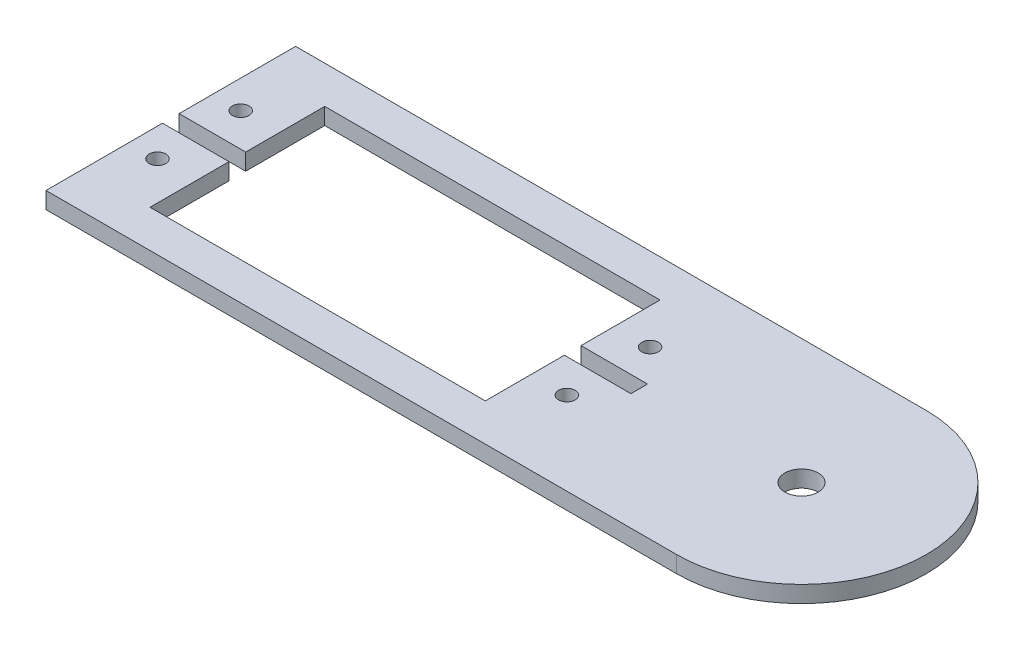
ISO-10303-21;
HEADER;
FILE_DESCRIPTION(('STEP AP214'),'2;1');
FILE_NAME('part.step','',(''),(''),'','','');
FILE_SCHEMA(('AUTOMOTIVE_DESIGN { 1 0 10303 214 1 1 1 1 }'));
ENDSEC;
DATA;
#1=APPLICATION_CONTEXT('core data for automotive mechanical design processes');
#2=APPLICATION_PROTOCOL_DEFINITION('international standard','automotive_design',2000,#1);
#3=PRODUCT_CONTEXT('',#1,'mechanical');
#4=PRODUCT('Part','Part','',(#3));
#5=PRODUCT_RELATED_PRODUCT_CATEGORY('part','',(#4));
#6=PRODUCT_DEFINITION_FORMATION('','',#4);
#7=PRODUCT_DEFINITION_CONTEXT('part definition',#1,'design');
#8=PRODUCT_DEFINITION('design','',#6,#7);
#9=PRODUCT_DEFINITION_SHAPE('','',#8);
#10=(LENGTH_UNIT() NAMED_UNIT(*) SI_UNIT(.MILLI.,.METRE.));
#11=(NAMED_UNIT(*) PLANE_ANGLE_UNIT() SI_UNIT($,.RADIAN.));
#12=(NAMED_UNIT(*) SI_UNIT($,.STERADIAN.) SOLID_ANGLE_UNIT());
#13=UNCERTAINTY_MEASURE_WITH_UNIT(LENGTH_MEASURE(1.E-05),#10,'distance_accuracy_value','');
#14=(GEOMETRIC_REPRESENTATION_CONTEXT(3) GLOBAL_UNCERTAINTY_ASSIGNED_CONTEXT((#13)) GLOBAL_UNIT_ASSIGNED_CONTEXT((#10,
#11,#12)) REPRESENTATION_CONTEXT('',''));
#15=CARTESIAN_POINT('',(0.,0.,0.));
#16=DIRECTION('',(0.,0.,1.));
#17=DIRECTION('',(1.,0.,0.));
#18=AXIS2_PLACEMENT_3D('',#15,#16,#17);
#19=CARTESIAN_POINT('',(75.8,2.,-15.));
#20=DIRECTION('',(0.,1.,0.));
#21=DIRECTION('',(0.,0.,1.));
#22=AXIS2_PLACEMENT_3D('',#19,#20,#21);
#23=PLANE('',#22);
#24=CARTESIAN_POINT('',(52.6,2.,-20.));
#25=DIRECTION('',(0.,1.,0.));
#26=DIRECTION('',(0.,0.,1.));
#27=AXIS2_PLACEMENT_3D('',#24,#25,#26);
#28=CIRCLE('',#27,0.999999999999998);
#29=CARTESIAN_POINT('',(52.6,2.,-19.));
#30=VERTEX_POINT('',#29);
#31=EDGE_CURVE('E349',#30,#30,#28,.T.);
#32=ORIENTED_EDGE('',*,*,#31,.F.);
#33=EDGE_LOOP('',(#32));
#34=FACE_BOUND('',#33,.T.);
#35=CARTESIAN_POINT('',(3.4,2.,-20.));
#36=DIRECTION('',(0.,1.,0.));
#37=DIRECTION('',(0.,0.,1.));
#38=AXIS2_PLACEMENT_3D('',#35,#36,#37);
#39=CIRCLE('',#38,0.999999999999999);
#40=CARTESIAN_POINT('',(3.4,2.,-19.));
#41=VERTEX_POINT('',#40);
#42=EDGE_CURVE('E361',#41,#41,#39,.T.);
#43=ORIENTED_EDGE('',*,*,#42,.F.);
#44=EDGE_LOOP('',(#43));
#45=FACE_BOUND('',#44,.T.);
#46=DIRECTION('',(1.,0.,0.));
#47=VECTOR('',#46,1.);
#48=CARTESIAN_POINT('',(0.,2.,0.));
#49=LINE('',#48,#47);
#50=CARTESIAN_POINT('',(0.,2.,0.));
#51=VERTEX_POINT('',#50);
#52=CARTESIAN_POINT('',(75.8,2.,0.));
#53=VERTEX_POINT('',#52);
#54=EDGE_CURVE('E211',#51,#53,#49,.T.);
#55=ORIENTED_EDGE('',*,*,#54,.T.);
#56=CARTESIAN_POINT('',(75.8,2.,-15.));
#57=DIRECTION('',(0.,1.,0.));
#58=DIRECTION('',(0.,0.,1.));
#59=AXIS2_PLACEMENT_3D('',#56,#57,#58);
#60=CIRCLE('',#59,15.);
#61=CARTESIAN_POINT('',(75.8,2.,-30.));
#62=VERTEX_POINT('',#61);
#63=EDGE_CURVE('E119',#53,#62,#60,.T.);
#64=ORIENTED_EDGE('',*,*,#63,.T.);
#65=DIRECTION('',(-1.,0.,0.));
#66=VECTOR('',#65,1.);
#67=CARTESIAN_POINT('',(0.,2.,-30.));
#68=LINE('',#67,#66);
#69=CARTESIAN_POINT('',(0.,2.,-30.));
#70=VERTEX_POINT('',#69);
#71=EDGE_CURVE('E250',#62,#70,#68,.T.);
#72=ORIENTED_EDGE('',*,*,#71,.T.);
#73=DIRECTION('',(0.,0.,1.));
#74=VECTOR('',#73,1.);
#75=CARTESIAN_POINT('',(0.,2.,-30.));
#76=LINE('',#75,#74);
#77=CARTESIAN_POINT('',(0.,2.,-16.));
#78=VERTEX_POINT('',#77);
#79=EDGE_CURVE('E269',#70,#78,#76,.T.);
#80=ORIENTED_EDGE('',*,*,#79,.T.);
#81=DIRECTION('',(1.,0.,0.));
#82=VECTOR('',#81,1.);
#83=CARTESIAN_POINT('',(0.,2.,-16.));
#84=LINE('',#83,#82);
#85=CARTESIAN_POINT('',(8.,2.,-16.));
#86=VERTEX_POINT('',#85);
#87=EDGE_CURVE('E266',#78,#86,#84,.T.);
#88=ORIENTED_EDGE('',*,*,#87,.T.);
#89=DIRECTION('',(0.,0.,-1.));
#90=VECTOR('',#89,1.);
#91=CARTESIAN_POINT('',(8.,2.,-16.));
#92=LINE('',#91,#90);
#93=CARTESIAN_POINT('',(8.,2.,-25.5));
#94=VERTEX_POINT('',#93);
#95=EDGE_CURVE('E268',#86,#94,#92,.T.);
#96=ORIENTED_EDGE('',*,*,#95,.T.);
#97=DIRECTION('',(1.,0.,0.));
#98=VECTOR('',#97,1.);
#99=CARTESIAN_POINT('',(8.,2.,-25.5));
#100=LINE('',#99,#98);
#101=CARTESIAN_POINT('',(48.3,2.,-25.5));
#102=VERTEX_POINT('',#101);
#103=EDGE_CURVE('E271',#94,#102,#100,.T.);
#104=ORIENTED_EDGE('',*,*,#103,.T.);
#105=DIRECTION('',(0.,0.,1.));
#106=VECTOR('',#105,1.);
#107=CARTESIAN_POINT('',(48.3,2.,-25.5));
#108=LINE('',#107,#106);
#109=CARTESIAN_POINT('',(48.3,2.,-16.));
#110=VERTEX_POINT('',#109);
#111=EDGE_CURVE('E277',#102,#110,#108,.T.);
#112=ORIENTED_EDGE('',*,*,#111,.T.);
#113=DIRECTION('',(1.,0.,0.));
#114=VECTOR('',#113,1.);
#115=CARTESIAN_POINT('',(48.3,2.,-16.));
#116=LINE('',#115,#114);
#117=CARTESIAN_POINT('',(56.3,2.,-16.));
#118=VERTEX_POINT('',#117);
#119=EDGE_CURVE('E279',#110,#118,#116,.T.);
#120=ORIENTED_EDGE('',*,*,#119,.T.);
#121=DIRECTION('',(0.,0.,1.));
#122=VECTOR('',#121,1.);
#123=CARTESIAN_POINT('',(56.3,2.,-14.));
#124=LINE('',#123,#122);
#125=CARTESIAN_POINT('',(56.3,2.,-14.));
#126=VERTEX_POINT('',#125);
#127=EDGE_CURVE('E281',#118,#126,#124,.T.);
#128=ORIENTED_EDGE('',*,*,#127,.T.);
#129=DIRECTION('',(-1.,0.,0.));
#130=VECTOR('',#129,1.);
#131=CARTESIAN_POINT('',(48.3,2.,-14.));
#132=LINE('',#131,#130);
#133=CARTESIAN_POINT('',(48.3,2.,-14.));
#134=VERTEX_POINT('',#133);
#135=EDGE_CURVE('E283',#126,#134,#132,.T.);
#136=ORIENTED_EDGE('',*,*,#135,.T.);
#137=DIRECTION('',(0.,0.,1.));
#138=VECTOR('',#137,1.);
#139=CARTESIAN_POINT('',(48.3,2.,-14.));
#140=LINE('',#139,#138);
#141=CARTESIAN_POINT('',(48.3,2.,-4.5));
#142=VERTEX_POINT('',#141);
#143=EDGE_CURVE('E285',#134,#142,#140,.T.);
#144=ORIENTED_EDGE('',*,*,#143,.T.);
#145=DIRECTION('',(-1.,0.,0.));
#146=VECTOR('',#145,1.);
#147=CARTESIAN_POINT('',(8.,2.,-4.5));
#148=LINE('',#147,#146);
#149=CARTESIAN_POINT('',(8.,2.,-4.5));
#150=VERTEX_POINT('',#149);
#151=EDGE_CURVE('E162',#142,#150,#148,.T.);
#152=ORIENTED_EDGE('',*,*,#151,.T.);
#153=DIRECTION('',(0.,0.,-1.));
#154=VECTOR('',#153,1.);
#155=CARTESIAN_POINT('',(8.,2.,-4.5));
#156=LINE('',#155,#154);
#157=CARTESIAN_POINT('',(8.,2.,-14.));
#158=VERTEX_POINT('',#157);
#159=EDGE_CURVE('E156',#150,#158,#156,.T.);
#160=ORIENTED_EDGE('',*,*,#159,.T.);
#161=DIRECTION('',(-1.,0.,0.));
#162=VECTOR('',#161,1.);
#163=CARTESIAN_POINT('',(0.,2.,-14.));
#164=LINE('',#163,#162);
#165=CARTESIAN_POINT('',(0.,2.,-14.));
#166=VERTEX_POINT('',#165);
#167=EDGE_CURVE('E160',#158,#166,#164,.T.);
#168=ORIENTED_EDGE('',*,*,#167,.T.);
#169=DIRECTION('',(0.,0.,1.));
#170=VECTOR('',#169,1.);
#171=CARTESIAN_POINT('',(0.,2.,-14.));
#172=LINE('',#171,#170);
#173=EDGE_CURVE('E52',#166,#51,#172,.T.);
#174=ORIENTED_EDGE('',*,*,#173,.T.);
#175=EDGE_LOOP('',(#55,#64,#72,#80,#88,#96,#104,#112,#120,#128,#136,#144,#152,#160,#168,#174));
#176=FACE_BOUND('',#175,.T.);
#177=CARTESIAN_POINT('',(3.4,2.,-10.));
#178=DIRECTION('',(0.,1.,0.));
#179=DIRECTION('',(0.,0.,1.));
#180=AXIS2_PLACEMENT_3D('',#177,#178,#179);
#181=CIRCLE('',#180,0.999999999999998);
#182=CARTESIAN_POINT('',(3.4,2.,-9.));
#183=VERTEX_POINT('',#182);
#184=EDGE_CURVE('E184',#183,#183,#181,.T.);
#185=ORIENTED_EDGE('',*,*,#184,.F.);
#186=EDGE_LOOP('',(#185));
#187=FACE_BOUND('',#186,.T.);
#188=CARTESIAN_POINT('',(52.6,2.,-10.));
#189=DIRECTION('',(0.,1.,0.));
#190=DIRECTION('',(0.,0.,1.));
#191=AXIS2_PLACEMENT_3D('',#188,#189,#190);
#192=CIRCLE('',#191,0.999999999999998);
#193=CARTESIAN_POINT('',(52.6,2.,-9.));
#194=VERTEX_POINT('',#193);
#195=EDGE_CURVE('E355',#194,#194,#192,.T.);
#196=ORIENTED_EDGE('',*,*,#195,.F.);
#197=EDGE_LOOP('',(#196));
#198=FACE_BOUND('',#197,.T.);
#199=CARTESIAN_POINT('',(75.8,2.,-15.));
#200=DIRECTION('',(0.,1.,0.));
#201=DIRECTION('',(0.,0.,1.));
#202=AXIS2_PLACEMENT_3D('',#199,#200,#201);
#203=CIRCLE('',#202,2.);
#204=CARTESIAN_POINT('',(75.8,2.,-13.));
#205=VERTEX_POINT('',#204);
#206=EDGE_CURVE('E340',#205,#205,#203,.T.);
#207=ORIENTED_EDGE('',*,*,#206,.F.);
#208=EDGE_LOOP('',(#207));
#209=FACE_BOUND('',#208,.T.);
#210=ADVANCED_FACE('F35',(#34,#45,#176,#187,#198,#209),#23,.T.);
#211=CARTESIAN_POINT('',(75.8,0.,-15.));
#212=DIRECTION('',(0.,1.,0.));
#213=DIRECTION('',(0.,0.,1.));
#214=AXIS2_PLACEMENT_3D('',#211,#212,#213);
#215=PLANE('',#214);
#216=DIRECTION('',(1.,0.,0.));
#217=VECTOR('',#216,1.);
#218=CARTESIAN_POINT('',(0.,0.,0.));
#219=LINE('',#218,#217);
#220=CARTESIAN_POINT('',(0.,0.,0.));
#221=VERTEX_POINT('',#220);
#222=CARTESIAN_POINT('',(75.8,0.,0.));
#223=VERTEX_POINT('',#222);
#224=EDGE_CURVE('E180',#221,#223,#219,.T.);
#225=ORIENTED_EDGE('',*,*,#224,.F.);
#226=DIRECTION('',(0.,0.,1.));
#227=VECTOR('',#226,1.);
#228=CARTESIAN_POINT('',(0.,0.,-14.));
#229=LINE('',#228,#227);
#230=CARTESIAN_POINT('',(0.,0.,-14.));
#231=VERTEX_POINT('',#230);
#232=EDGE_CURVE('E111',#231,#221,#229,.T.);
#233=ORIENTED_EDGE('',*,*,#232,.F.);
#234=DIRECTION('',(-1.,0.,0.));
#235=VECTOR('',#234,1.);
#236=CARTESIAN_POINT('',(0.,0.,-14.));
#237=LINE('',#236,#235);
#238=CARTESIAN_POINT('',(8.,0.,-14.));
#239=VERTEX_POINT('',#238);
#240=EDGE_CURVE('E105',#239,#231,#237,.T.);
#241=ORIENTED_EDGE('',*,*,#240,.F.);
#242=DIRECTION('',(0.,0.,-1.));
#243=VECTOR('',#242,1.);
#244=CARTESIAN_POINT('',(8.,0.,-4.5));
#245=LINE('',#244,#243);
#246=CARTESIAN_POINT('',(8.,0.,-4.5));
#247=VERTEX_POINT('',#246);
#248=EDGE_CURVE('E170',#247,#239,#245,.T.);
#249=ORIENTED_EDGE('',*,*,#248,.F.);
#250=DIRECTION('',(-1.,0.,0.));
#251=VECTOR('',#250,1.);
#252=CARTESIAN_POINT('',(8.,0.,-4.5));
#253=LINE('',#252,#251);
#254=CARTESIAN_POINT('',(48.3,0.,-4.5));
#255=VERTEX_POINT('',#254);
#256=EDGE_CURVE('E206',#255,#247,#253,.T.);
#257=ORIENTED_EDGE('',*,*,#256,.F.);
#258=DIRECTION('',(0.,0.,1.));
#259=VECTOR('',#258,1.);
#260=CARTESIAN_POINT('',(48.3,0.,-14.));
#261=LINE('',#260,#259);
#262=CARTESIAN_POINT('',(48.3,0.,-14.));
#263=VERTEX_POINT('',#262);
#264=EDGE_CURVE('E204',#263,#255,#261,.T.);
#265=ORIENTED_EDGE('',*,*,#264,.F.);
#266=DIRECTION('',(-1.,0.,0.));
#267=VECTOR('',#266,1.);
#268=CARTESIAN_POINT('',(48.3,0.,-14.));
#269=LINE('',#268,#267);
#270=CARTESIAN_POINT('',(56.3,0.,-14.));
#271=VERTEX_POINT('',#270);
#272=EDGE_CURVE('E202',#271,#263,#269,.T.);
#273=ORIENTED_EDGE('',*,*,#272,.F.);
#274=DIRECTION('',(0.,0.,1.));
#275=VECTOR('',#274,1.);
#276=CARTESIAN_POINT('',(56.3,0.,-14.));
#277=LINE('',#276,#275);
#278=CARTESIAN_POINT('',(56.3,0.,-16.));
#279=VERTEX_POINT('',#278);
#280=EDGE_CURVE('E200',#279,#271,#277,.T.);
#281=ORIENTED_EDGE('',*,*,#280,.F.);
#282=DIRECTION('',(1.,0.,0.));
#283=VECTOR('',#282,1.);
#284=CARTESIAN_POINT('',(48.3,0.,-16.));
#285=LINE('',#284,#283);
#286=CARTESIAN_POINT('',(48.3,0.,-16.));
#287=VERTEX_POINT('',#286);
#288=EDGE_CURVE('E198',#287,#279,#285,.T.);
#289=ORIENTED_EDGE('',*,*,#288,.F.);
#290=DIRECTION('',(0.,0.,1.));
#291=VECTOR('',#290,1.);
#292=CARTESIAN_POINT('',(48.3,0.,-25.5));
#293=LINE('',#292,#291);
#294=CARTESIAN_POINT('',(48.3,0.,-25.5));
#295=VERTEX_POINT('',#294);
#296=EDGE_CURVE('E196',#295,#287,#293,.T.);
#297=ORIENTED_EDGE('',*,*,#296,.F.);
#298=DIRECTION('',(1.,0.,0.));
#299=VECTOR('',#298,1.);
#300=CARTESIAN_POINT('',(8.,0.,-25.5));
#301=LINE('',#300,#299);
#302=CARTESIAN_POINT('',(8.,0.,-25.5));
#303=VERTEX_POINT('',#302);
#304=EDGE_CURVE('E194',#303,#295,#301,.T.);
#305=ORIENTED_EDGE('',*,*,#304,.F.);
#306=DIRECTION('',(0.,0.,-1.));
#307=VECTOR('',#306,1.);
#308=CARTESIAN_POINT('',(8.,0.,-16.));
#309=LINE('',#308,#307);
#310=CARTESIAN_POINT('',(8.,0.,-16.));
#311=VERTEX_POINT('',#310);
#312=EDGE_CURVE('E192',#311,#303,#309,.T.);
#313=ORIENTED_EDGE('',*,*,#312,.F.);
#314=DIRECTION('',(1.,0.,0.));
#315=VECTOR('',#314,1.);
#316=CARTESIAN_POINT('',(0.,0.,-16.));
#317=LINE('',#316,#315);
#318=CARTESIAN_POINT('',(0.,0.,-16.));
#319=VERTEX_POINT('',#318);
#320=EDGE_CURVE('E190',#319,#311,#317,.T.);
#321=ORIENTED_EDGE('',*,*,#320,.F.);
#322=DIRECTION('',(0.,0.,1.));
#323=VECTOR('',#322,1.);
#324=CARTESIAN_POINT('',(0.,0.,-30.));
#325=LINE('',#324,#323);
#326=CARTESIAN_POINT('',(0.,0.,-30.));
#327=VERTEX_POINT('',#326);
#328=EDGE_CURVE('E188',#327,#319,#325,.T.);
#329=ORIENTED_EDGE('',*,*,#328,.F.);
#330=DIRECTION('',(-1.,0.,0.));
#331=VECTOR('',#330,1.);
#332=CARTESIAN_POINT('',(0.,0.,-30.));
#333=LINE('',#332,#331);
#334=CARTESIAN_POINT('',(75.8,0.,-30.));
#335=VERTEX_POINT('',#334);
#336=EDGE_CURVE('E186',#335,#327,#333,.T.);
#337=ORIENTED_EDGE('',*,*,#336,.F.);
#338=CARTESIAN_POINT('',(75.8,0.,-15.));
#339=DIRECTION('',(0.,1.,0.));
#340=DIRECTION('',(0.,0.,1.));
#341=AXIS2_PLACEMENT_3D('',#338,#339,#340);
#342=CIRCLE('',#341,15.);
#343=EDGE_CURVE('E183',#223,#335,#342,.T.);
#344=ORIENTED_EDGE('',*,*,#343,.F.);
#345=EDGE_LOOP('',(#225,#233,#241,#249,#257,#265,#273,#281,#289,#297,#305,#313,#321,#329,#337,#344));
#346=FACE_BOUND('',#345,.T.);
#347=CARTESIAN_POINT('',(3.4,0.,-10.));
#348=DIRECTION('',(0.,1.,0.));
#349=DIRECTION('',(0.,0.,1.));
#350=AXIS2_PLACEMENT_3D('',#347,#348,#349);
#351=CIRCLE('',#350,0.999999999999998);
#352=CARTESIAN_POINT('',(3.4,0.,-9.));
#353=VERTEX_POINT('',#352);
#354=EDGE_CURVE('E364',#353,#353,#351,.T.);
#355=ORIENTED_EDGE('',*,*,#354,.T.);
#356=EDGE_LOOP('',(#355));
#357=FACE_BOUND('',#356,.T.);
#358=CARTESIAN_POINT('',(3.4,0.,-20.));
#359=DIRECTION('',(0.,1.,0.));
#360=DIRECTION('',(0.,0.,1.));
#361=AXIS2_PLACEMENT_3D('',#358,#359,#360);
#362=CIRCLE('',#361,0.999999999999999);
#363=CARTESIAN_POINT('',(3.4,0.,-19.));
#364=VERTEX_POINT('',#363);
#365=EDGE_CURVE('E358',#364,#364,#362,.T.);
#366=ORIENTED_EDGE('',*,*,#365,.T.);
#367=EDGE_LOOP('',(#366));
#368=FACE_BOUND('',#367,.T.);
#369=CARTESIAN_POINT('',(52.6,0.,-10.));
#370=DIRECTION('',(0.,1.,0.));
#371=DIRECTION('',(0.,0.,1.));
#372=AXIS2_PLACEMENT_3D('',#369,#370,#371);
#373=CIRCLE('',#372,0.999999999999998);
#374=CARTESIAN_POINT('',(52.6,0.,-9.));
#375=VERTEX_POINT('',#374);
#376=EDGE_CURVE('E352',#375,#375,#373,.T.);
#377=ORIENTED_EDGE('',*,*,#376,.T.);
#378=EDGE_LOOP('',(#377));
#379=FACE_BOUND('',#378,.T.);
#380=CARTESIAN_POINT('',(52.6,0.,-20.));
#381=DIRECTION('',(0.,1.,0.));
#382=DIRECTION('',(0.,0.,1.));
#383=AXIS2_PLACEMENT_3D('',#380,#381,#382);
#384=CIRCLE('',#383,0.999999999999998);
#385=CARTESIAN_POINT('',(52.6,0.,-19.));
#386=VERTEX_POINT('',#385);
#387=EDGE_CURVE('E346',#386,#386,#384,.T.);
#388=ORIENTED_EDGE('',*,*,#387,.T.);
#389=EDGE_LOOP('',(#388));
#390=FACE_BOUND('',#389,.T.);
#391=CARTESIAN_POINT('',(75.8,0.,-15.));
#392=DIRECTION('',(0.,1.,0.));
#393=DIRECTION('',(0.,0.,1.));
#394=AXIS2_PLACEMENT_3D('',#391,#392,#393);
#395=CIRCLE('',#394,2.);
#396=CARTESIAN_POINT('',(75.8,0.,-13.));
#397=VERTEX_POINT('',#396);
#398=EDGE_CURVE('E343',#397,#397,#395,.T.);
#399=ORIENTED_EDGE('',*,*,#398,.T.);
#400=EDGE_LOOP('',(#399));
#401=FACE_BOUND('',#400,.T.);
#402=ADVANCED_FACE('F254',(#346,#357,#368,#379,#390,#401),#215,.F.);
#403=CARTESIAN_POINT('',(0.,2.,0.));
#404=DIRECTION('',(0.,0.,-1.));
#405=DIRECTION('',(-1.,0.,0.));
#406=AXIS2_PLACEMENT_3D('',#403,#404,#405);
#407=PLANE('',#406);
#408=ORIENTED_EDGE('',*,*,#224,.T.);
#409=DIRECTION('',(0.,-1.,0.));
#410=VECTOR('',#409,1.);
#411=CARTESIAN_POINT('',(75.8,2.,0.));
#412=LINE('',#411,#410);
#413=EDGE_CURVE('E11',#53,#223,#412,.T.);
#414=ORIENTED_EDGE('',*,*,#413,.F.);
#415=ORIENTED_EDGE('',*,*,#54,.F.);
#416=DIRECTION('',(0.,-1.,0.));
#417=VECTOR('',#416,1.);
#418=CARTESIAN_POINT('',(0.,2.,0.));
#419=LINE('',#418,#417);
#420=EDGE_CURVE('E176',#51,#221,#419,.T.);
#421=ORIENTED_EDGE('',*,*,#420,.T.);
#422=EDGE_LOOP('',(#408,#414,#415,#421));
#423=FACE_BOUND('',#422,.T.);
#424=ADVANCED_FACE('F37',(#423),#407,.F.);
#425=CARTESIAN_POINT('',(75.8,2.,-15.));
#426=DIRECTION('',(0.,-1.,0.));
#427=DIRECTION('',(0.,0.,-1.));
#428=AXIS2_PLACEMENT_3D('',#425,#426,#427);
#429=CYLINDRICAL_SURFACE('',#428,15.);
#430=ORIENTED_EDGE('',*,*,#343,.T.);
#431=DIRECTION('',(0.,-1.,0.));
#432=VECTOR('',#431,1.);
#433=CARTESIAN_POINT('',(75.8,2.,-30.));
#434=LINE('',#433,#432);
#435=EDGE_CURVE('E44',#62,#335,#434,.T.);
#436=ORIENTED_EDGE('',*,*,#435,.F.);
#437=ORIENTED_EDGE('',*,*,#63,.F.);
#438=ORIENTED_EDGE('',*,*,#413,.T.);
#439=EDGE_LOOP('',(#430,#436,#437,#438));
#440=FACE_BOUND('',#439,.T.);
#441=ADVANCED_FACE('F523',(#440),#429,.T.);
#442=CARTESIAN_POINT('',(0.,2.,-30.));
#443=DIRECTION('',(0.,0.,1.));
#444=DIRECTION('',(1.,0.,0.));
#445=AXIS2_PLACEMENT_3D('',#442,#443,#444);
#446=PLANE('',#445);
#447=ORIENTED_EDGE('',*,*,#336,.T.);
#448=DIRECTION('',(0.,-1.,0.));
#449=VECTOR('',#448,1.);
#450=CARTESIAN_POINT('',(0.,2.,-30.));
#451=LINE('',#450,#449);
#452=EDGE_CURVE('E242',#70,#327,#451,.T.);
#453=ORIENTED_EDGE('',*,*,#452,.F.);
#454=ORIENTED_EDGE('',*,*,#71,.F.);
#455=ORIENTED_EDGE('',*,*,#435,.T.);
#456=EDGE_LOOP('',(#447,#453,#454,#455));
#457=FACE_BOUND('',#456,.T.);
#458=ADVANCED_FACE('F248',(#457),#446,.F.);
#459=CARTESIAN_POINT('',(0.,2.,-30.));
#460=DIRECTION('',(1.,0.,0.));
#461=DIRECTION('',(0.,0.,-1.));
#462=AXIS2_PLACEMENT_3D('',#459,#460,#461);
#463=PLANE('',#462);
#464=ORIENTED_EDGE('',*,*,#328,.T.);
#465=DIRECTION('',(0.,-1.,0.));
#466=VECTOR('',#465,1.);
#467=CARTESIAN_POINT('',(0.,2.,-16.));
#468=LINE('',#467,#466);
#469=EDGE_CURVE('E239',#78,#319,#468,.T.);
#470=ORIENTED_EDGE('',*,*,#469,.F.);
#471=ORIENTED_EDGE('',*,*,#79,.F.);
#472=ORIENTED_EDGE('',*,*,#452,.T.);
#473=EDGE_LOOP('',(#464,#470,#471,#472));
#474=FACE_BOUND('',#473,.T.);
#475=ADVANCED_FACE('F260',(#474),#463,.F.);
#476=CARTESIAN_POINT('',(0.,2.,-16.));
#477=DIRECTION('',(0.,0.,-1.));
#478=DIRECTION('',(-1.,0.,0.));
#479=AXIS2_PLACEMENT_3D('',#476,#477,#478);
#480=PLANE('',#479);
#481=ORIENTED_EDGE('',*,*,#320,.T.);
#482=DIRECTION('',(0.,-1.,0.));
#483=VECTOR('',#482,1.);
#484=CARTESIAN_POINT('',(8.,2.,-16.));
#485=LINE('',#484,#483);
#486=EDGE_CURVE('E236',#86,#311,#485,.T.);
#487=ORIENTED_EDGE('',*,*,#486,.F.);
#488=ORIENTED_EDGE('',*,*,#87,.F.);
#489=ORIENTED_EDGE('',*,*,#469,.T.);
#490=EDGE_LOOP('',(#481,#487,#488,#489));
#491=FACE_BOUND('',#490,.T.);
#492=ADVANCED_FACE('F264',(#491),#480,.F.);
#493=CARTESIAN_POINT('',(8.,2.,-16.));
#494=DIRECTION('',(-1.,0.,0.));
#495=DIRECTION('',(0.,0.,1.));
#496=AXIS2_PLACEMENT_3D('',#493,#494,#495);
#497=PLANE('',#496);
#498=ORIENTED_EDGE('',*,*,#312,.T.);
#499=DIRECTION('',(0.,-1.,0.));
#500=VECTOR('',#499,1.);
#501=CARTESIAN_POINT('',(8.,2.,-25.5));
#502=LINE('',#501,#500);
#503=EDGE_CURVE('E233',#94,#303,#502,.T.);
#504=ORIENTED_EDGE('',*,*,#503,.F.);
#505=ORIENTED_EDGE('',*,*,#95,.F.);
#506=ORIENTED_EDGE('',*,*,#486,.T.);
#507=EDGE_LOOP('',(#498,#504,#505,#506));
#508=FACE_BOUND('',#507,.T.);
#509=ADVANCED_FACE('F488',(#508),#497,.F.);
#510=CARTESIAN_POINT('',(8.,2.,-25.5));
#511=DIRECTION('',(0.,0.,-1.));
#512=DIRECTION('',(-1.,0.,0.));
#513=AXIS2_PLACEMENT_3D('',#510,#511,#512);
#514=PLANE('',#513);
#515=ORIENTED_EDGE('',*,*,#304,.T.);
#516=DIRECTION('',(0.,-1.,0.));
#517=VECTOR('',#516,1.);
#518=CARTESIAN_POINT('',(48.3,2.,-25.5));
#519=LINE('',#518,#517);
#520=EDGE_CURVE('E230',#102,#295,#519,.T.);
#521=ORIENTED_EDGE('',*,*,#520,.F.);
#522=ORIENTED_EDGE('',*,*,#103,.F.);
#523=ORIENTED_EDGE('',*,*,#503,.T.);
#524=EDGE_LOOP('',(#515,#521,#522,#523));
#525=FACE_BOUND('',#524,.T.);
#526=ADVANCED_FACE('F478',(#525),#514,.F.);
#527=CARTESIAN_POINT('',(48.3,2.,-25.5));
#528=DIRECTION('',(1.,0.,0.));
#529=DIRECTION('',(0.,0.,-1.));
#530=AXIS2_PLACEMENT_3D('',#527,#528,#529);
#531=PLANE('',#530);
#532=ORIENTED_EDGE('',*,*,#296,.T.);
#533=DIRECTION('',(0.,-1.,0.));
#534=VECTOR('',#533,1.);
#535=CARTESIAN_POINT('',(48.3,2.,-16.));
#536=LINE('',#535,#534);
#537=EDGE_CURVE('E227',#110,#287,#536,.T.);
#538=ORIENTED_EDGE('',*,*,#537,.F.);
#539=ORIENTED_EDGE('',*,*,#111,.F.);
#540=ORIENTED_EDGE('',*,*,#520,.T.);
#541=EDGE_LOOP('',(#532,#538,#539,#540));
#542=FACE_BOUND('',#541,.T.);
#543=ADVANCED_FACE('F468',(#542),#531,.F.);
#544=CARTESIAN_POINT('',(48.3,2.,-16.));
#545=DIRECTION('',(0.,0.,-1.));
#546=DIRECTION('',(-1.,0.,0.));
#547=AXIS2_PLACEMENT_3D('',#544,#545,#546);
#548=PLANE('',#547);
#549=ORIENTED_EDGE('',*,*,#288,.T.);
#550=DIRECTION('',(0.,-1.,0.));
#551=VECTOR('',#550,1.);
#552=CARTESIAN_POINT('',(56.3,2.,-16.));
#553=LINE('',#552,#551);
#554=EDGE_CURVE('E224',#118,#279,#553,.T.);
#555=ORIENTED_EDGE('',*,*,#554,.F.);
#556=ORIENTED_EDGE('',*,*,#119,.F.);
#557=ORIENTED_EDGE('',*,*,#537,.T.);
#558=EDGE_LOOP('',(#549,#555,#556,#557));
#559=FACE_BOUND('',#558,.T.);
#560=ADVANCED_FACE('F458',(#559),#548,.F.);
#561=CARTESIAN_POINT('',(56.3,2.,-14.));
#562=DIRECTION('',(1.,0.,0.));
#563=DIRECTION('',(0.,0.,-1.));
#564=AXIS2_PLACEMENT_3D('',#561,#562,#563);
#565=PLANE('',#564);
#566=ORIENTED_EDGE('',*,*,#280,.T.);
#567=DIRECTION('',(0.,-1.,0.));
#568=VECTOR('',#567,1.);
#569=CARTESIAN_POINT('',(56.3,2.,-14.));
#570=LINE('',#569,#568);
#571=EDGE_CURVE('E221',#126,#271,#570,.T.);
#572=ORIENTED_EDGE('',*,*,#571,.F.);
#573=ORIENTED_EDGE('',*,*,#127,.F.);
#574=ORIENTED_EDGE('',*,*,#554,.T.);
#575=EDGE_LOOP('',(#566,#572,#573,#574));
#576=FACE_BOUND('',#575,.T.);
#577=ADVANCED_FACE('F448',(#576),#565,.F.);
#578=CARTESIAN_POINT('',(48.3,2.,-14.));
#579=DIRECTION('',(0.,0.,1.));
#580=DIRECTION('',(1.,0.,0.));
#581=AXIS2_PLACEMENT_3D('',#578,#579,#580);
#582=PLANE('',#581);
#583=ORIENTED_EDGE('',*,*,#272,.T.);
#584=DIRECTION('',(0.,-1.,0.));
#585=VECTOR('',#584,1.);
#586=CARTESIAN_POINT('',(48.3,2.,-14.));
#587=LINE('',#586,#585);
#588=EDGE_CURVE('E218',#134,#263,#587,.T.);
#589=ORIENTED_EDGE('',*,*,#588,.F.);
#590=ORIENTED_EDGE('',*,*,#135,.F.);
#591=ORIENTED_EDGE('',*,*,#571,.T.);
#592=EDGE_LOOP('',(#583,#589,#590,#591));
#593=FACE_BOUND('',#592,.T.);
#594=ADVANCED_FACE('F439',(#593),#582,.F.);
#595=CARTESIAN_POINT('',(48.3,2.,-14.));
#596=DIRECTION('',(1.,0.,0.));
#597=DIRECTION('',(0.,0.,-1.));
#598=AXIS2_PLACEMENT_3D('',#595,#596,#597);
#599=PLANE('',#598);
#600=ORIENTED_EDGE('',*,*,#264,.T.);
#601=DIRECTION('',(0.,-1.,0.));
#602=VECTOR('',#601,1.);
#603=CARTESIAN_POINT('',(48.3,2.,-4.5));
#604=LINE('',#603,#602);
#605=EDGE_CURVE('E215',#142,#255,#604,.T.);
#606=ORIENTED_EDGE('',*,*,#605,.F.);
#607=ORIENTED_EDGE('',*,*,#143,.F.);
#608=ORIENTED_EDGE('',*,*,#588,.T.);
#609=EDGE_LOOP('',(#600,#606,#607,#608));
#610=FACE_BOUND('',#609,.T.);
#611=ADVANCED_FACE('F291',(#610),#599,.F.);
#612=CARTESIAN_POINT('',(8.,2.,-4.5));
#613=DIRECTION('',(0.,0.,1.));
#614=DIRECTION('',(1.,0.,0.));
#615=AXIS2_PLACEMENT_3D('',#612,#613,#614);
#616=PLANE('',#615);
#617=ORIENTED_EDGE('',*,*,#256,.T.);
#618=DIRECTION('',(0.,-1.,0.));
#619=VECTOR('',#618,1.);
#620=CARTESIAN_POINT('',(8.,2.,-4.5));
#621=LINE('',#620,#619);
#622=EDGE_CURVE('E171',#150,#247,#621,.T.);
#623=ORIENTED_EDGE('',*,*,#622,.F.);
#624=ORIENTED_EDGE('',*,*,#151,.F.);
#625=ORIENTED_EDGE('',*,*,#605,.T.);
#626=EDGE_LOOP('',(#617,#623,#624,#625));
#627=FACE_BOUND('',#626,.T.);
#628=ADVANCED_FACE('F295',(#627),#616,.F.);
#629=CARTESIAN_POINT('',(8.,2.,-4.5));
#630=DIRECTION('',(-1.,0.,0.));
#631=DIRECTION('',(0.,0.,1.));
#632=AXIS2_PLACEMENT_3D('',#629,#630,#631);
#633=PLANE('',#632);
#634=ORIENTED_EDGE('',*,*,#248,.T.);
#635=DIRECTION('',(0.,-1.,0.));
#636=VECTOR('',#635,1.);
#637=CARTESIAN_POINT('',(8.,2.,-14.));
#638=LINE('',#637,#636);
#639=EDGE_CURVE('E167',#158,#239,#638,.T.);
#640=ORIENTED_EDGE('',*,*,#639,.F.);
#641=ORIENTED_EDGE('',*,*,#159,.F.);
#642=ORIENTED_EDGE('',*,*,#622,.T.);
#643=EDGE_LOOP('',(#634,#640,#641,#642));
#644=FACE_BOUND('',#643,.T.);
#645=ADVANCED_FACE('F168',(#644),#633,.F.);
#646=CARTESIAN_POINT('',(0.,2.,-14.));
#647=DIRECTION('',(0.,0.,1.));
#648=DIRECTION('',(1.,0.,0.));
#649=AXIS2_PLACEMENT_3D('',#646,#647,#648);
#650=PLANE('',#649);
#651=ORIENTED_EDGE('',*,*,#240,.T.);
#652=DIRECTION('',(0.,-1.,0.));
#653=VECTOR('',#652,1.);
#654=CARTESIAN_POINT('',(0.,2.,-14.));
#655=LINE('',#654,#653);
#656=EDGE_CURVE('E172',#166,#231,#655,.T.);
#657=ORIENTED_EDGE('',*,*,#656,.F.);
#658=ORIENTED_EDGE('',*,*,#167,.F.);
#659=ORIENTED_EDGE('',*,*,#639,.T.);
#660=EDGE_LOOP('',(#651,#657,#658,#659));
#661=FACE_BOUND('',#660,.T.);
#662=ADVANCED_FACE('F174',(#661),#650,.F.);
#663=CARTESIAN_POINT('',(0.,2.,-14.));
#664=DIRECTION('',(1.,0.,0.));
#665=DIRECTION('',(0.,0.,-1.));
#666=AXIS2_PLACEMENT_3D('',#663,#664,#665);
#667=PLANE('',#666);
#668=ORIENTED_EDGE('',*,*,#232,.T.);
#669=ORIENTED_EDGE('',*,*,#420,.F.);
#670=ORIENTED_EDGE('',*,*,#173,.F.);
#671=ORIENTED_EDGE('',*,*,#656,.T.);
#672=EDGE_LOOP('',(#668,#669,#670,#671));
#673=FACE_BOUND('',#672,.T.);
#674=ADVANCED_FACE('F299',(#673),#667,.F.);
#675=CARTESIAN_POINT('',(3.4,2.,-10.));
#676=DIRECTION('',(0.,-1.,0.));
#677=DIRECTION('',(0.,0.,-1.));
#678=AXIS2_PLACEMENT_3D('',#675,#676,#677);
#679=CYLINDRICAL_SURFACE('',#678,0.999999999999998);
#680=ORIENTED_EDGE('',*,*,#184,.T.);
#681=EDGE_LOOP('',(#680));
#682=FACE_BOUND('',#681,.T.);
#683=ORIENTED_EDGE('',*,*,#354,.F.);
#684=EDGE_LOOP('',(#683));
#685=FACE_BOUND('',#684,.T.);
#686=ADVANCED_FACE('F301',(#682,#685),#679,.F.);
#687=CARTESIAN_POINT('',(3.4,2.,-20.));
#688=DIRECTION('',(0.,-1.,0.));
#689=DIRECTION('',(0.,0.,-1.));
#690=AXIS2_PLACEMENT_3D('',#687,#688,#689);
#691=CYLINDRICAL_SURFACE('',#690,0.999999999999999);
#692=ORIENTED_EDGE('',*,*,#42,.T.);
#693=EDGE_LOOP('',(#692));
#694=FACE_BOUND('',#693,.T.);
#695=ORIENTED_EDGE('',*,*,#365,.F.);
#696=EDGE_LOOP('',(#695));
#697=FACE_BOUND('',#696,.T.);
#698=ADVANCED_FACE('F307',(#694,#697),#691,.F.);
#699=CARTESIAN_POINT('',(52.6,2.,-10.));
#700=DIRECTION('',(0.,-1.,0.));
#701=DIRECTION('',(0.,0.,-1.));
#702=AXIS2_PLACEMENT_3D('',#699,#700,#701);
#703=CYLINDRICAL_SURFACE('',#702,0.999999999999998);
#704=ORIENTED_EDGE('',*,*,#195,.T.);
#705=EDGE_LOOP('',(#704));
#706=FACE_BOUND('',#705,.T.);
#707=ORIENTED_EDGE('',*,*,#376,.F.);
#708=EDGE_LOOP('',(#707));
#709=FACE_BOUND('',#708,.T.);
#710=ADVANCED_FACE('F323',(#706,#709),#703,.F.);
#711=CARTESIAN_POINT('',(52.6,2.,-20.));
#712=DIRECTION('',(0.,-1.,0.));
#713=DIRECTION('',(0.,0.,-1.));
#714=AXIS2_PLACEMENT_3D('',#711,#712,#713);
#715=CYLINDRICAL_SURFACE('',#714,0.999999999999998);
#716=ORIENTED_EDGE('',*,*,#31,.T.);
#717=EDGE_LOOP('',(#716));
#718=FACE_BOUND('',#717,.T.);
#719=ORIENTED_EDGE('',*,*,#387,.F.);
#720=EDGE_LOOP('',(#719));
#721=FACE_BOUND('',#720,.T.);
#722=ADVANCED_FACE('F327',(#718,#721),#715,.F.);
#723=CARTESIAN_POINT('',(75.8,2.,-15.));
#724=DIRECTION('',(0.,-1.,0.));
#725=DIRECTION('',(0.,0.,-1.));
#726=AXIS2_PLACEMENT_3D('',#723,#724,#725);
#727=CYLINDRICAL_SURFACE('',#726,2.);
#728=ORIENTED_EDGE('',*,*,#206,.T.);
#729=EDGE_LOOP('',(#728));
#730=FACE_BOUND('',#729,.T.);
#731=ORIENTED_EDGE('',*,*,#398,.F.);
#732=EDGE_LOOP('',(#731));
#733=FACE_BOUND('',#732,.T.);
#734=ADVANCED_FACE('F331',(#730,#733),#727,.F.);
#735=CLOSED_SHELL('',(#210,#402,#424,#441,#458,#475,#492,#509,#526,#543,#560,#577,#594,#611,
#628,#645,#662,#674,#686,#698,#710,#722,#734));
#736=MANIFOLD_SOLID_BREP('B2',#735);
#737=ADVANCED_BREP_SHAPE_REPRESENTATION('',(#18,#736),#14);
#738=SHAPE_DEFINITION_REPRESENTATION(#9,#737);
ENDSEC;
END-ISO-10303-21;
